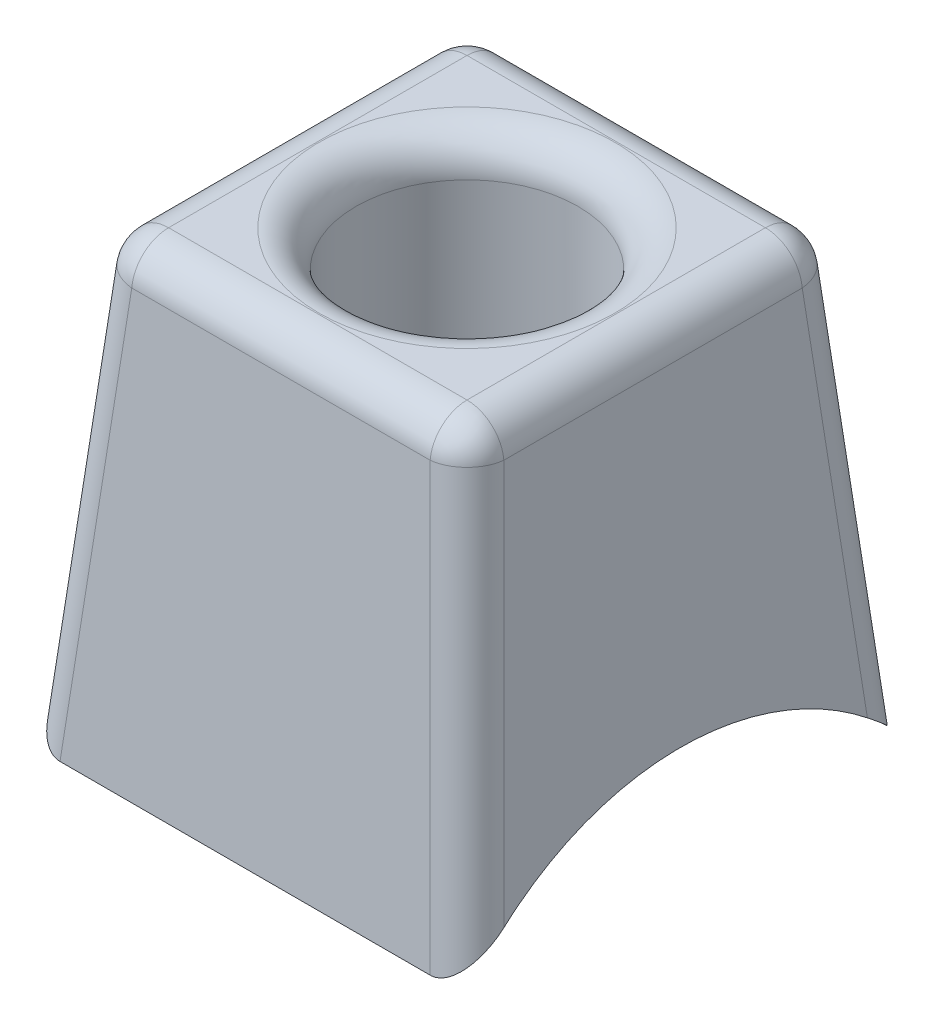
ISO-10303-21;
HEADER;
FILE_DESCRIPTION(('STEP AP214'),'2;1');
FILE_NAME('part.step','',(''),(''),'','','');
FILE_SCHEMA(('AUTOMOTIVE_DESIGN { 1 0 10303 214 1 1 1 1 }'));
ENDSEC;
DATA;
#1=APPLICATION_CONTEXT('core data for automotive mechanical design processes');
#2=APPLICATION_PROTOCOL_DEFINITION('international standard','automotive_design',2000,#1);
#3=PRODUCT_CONTEXT('',#1,'mechanical');
#4=PRODUCT('Part','Part','',(#3));
#5=PRODUCT_RELATED_PRODUCT_CATEGORY('part','',(#4));
#6=PRODUCT_DEFINITION_FORMATION('','',#4);
#7=PRODUCT_DEFINITION_CONTEXT('part definition',#1,'design');
#8=PRODUCT_DEFINITION('design','',#6,#7);
#9=PRODUCT_DEFINITION_SHAPE('','',#8);
#10=(LENGTH_UNIT() NAMED_UNIT(*) SI_UNIT(.MILLI.,.METRE.));
#11=(NAMED_UNIT(*) PLANE_ANGLE_UNIT() SI_UNIT($,.RADIAN.));
#12=(NAMED_UNIT(*) SI_UNIT($,.STERADIAN.) SOLID_ANGLE_UNIT());
#13=UNCERTAINTY_MEASURE_WITH_UNIT(LENGTH_MEASURE(1.E-05),#10,'distance_accuracy_value','');
#14=(GEOMETRIC_REPRESENTATION_CONTEXT(3) GLOBAL_UNCERTAINTY_ASSIGNED_CONTEXT((#13)) GLOBAL_UNIT_ASSIGNED_CONTEXT((#10,
#11,#12)) REPRESENTATION_CONTEXT('',''));
#15=CARTESIAN_POINT('',(0.,0.,0.));
#16=DIRECTION('',(0.,0.,1.));
#17=DIRECTION('',(1.,0.,0.));
#18=AXIS2_PLACEMENT_3D('',#15,#16,#17);
#19=CARTESIAN_POINT('',(0.,0.,0.));
#20=DIRECTION('',(0.996194698091746,0.0871557427476582,0.));
#21=DIRECTION('',(-0.0871557427476582,0.996194698091746,0.));
#22=AXIS2_PLACEMENT_3D('',#19,#20,#21);
#23=PLANE('',#22);
#24=DIRECTION('',(-0.0868265938642476,0.992432509138967,-0.0868265938642476));
#25=VECTOR('',#24,1.);
#26=CARTESIAN_POINT('',(0.00751016977360886,-0.0858416333149665,-0.988684528318136));
#27=LINE('',#26,#25);
#28=CARTESIAN_POINT('',(-0.970000438236766,11.0871557427477,-1.96619513632851));
#29=VERTEX_POINT('',#28);
#30=CARTESIAN_POINT('',(-0.089327435800209,1.02101726326794,-1.08552213389195));
#31=VERTEX_POINT('',#30);
#32=EDGE_CURVE('E140',#29,#31,#27,.F.);
#33=ORIENTED_EDGE('',*,*,#32,.T.);
#34=CARTESIAN_POINT('',(0.462946492454005,-5.29150262212918,-6.));
#35=DIRECTION('',(0.996194698091746,0.0871557427476582,0.));
#36=DIRECTION('',(0.0871557427476582,-0.996194698091746,0.));
#37=AXIS2_PLACEMENT_3D('',#34,#35,#36);
#38=ELLIPSE('',#37,8.03055870034678,8.);
#39=CARTESIAN_POINT('',(-0.0893274358002088,1.02101726326794,-10.914477866108));
#40=VERTEX_POINT('',#39);
#41=EDGE_CURVE('E258',#31,#40,#38,.F.);
#42=ORIENTED_EDGE('',*,*,#41,.T.);
#43=DIRECTION('',(-0.0868265938642476,0.992432509138967,0.0868265938642477));
#44=VECTOR('',#43,1.);
#45=CARTESIAN_POINT('',(-0.0829561190511952,0.948192779589257,-10.9208491828571));
#46=LINE('',#45,#44);
#47=CARTESIAN_POINT('',(-0.970000438236766,11.0871557427477,-10.0338048636715));
#48=VERTEX_POINT('',#47);
#49=EDGE_CURVE('E148',#40,#48,#46,.T.);
#50=ORIENTED_EDGE('',*,*,#49,.T.);
#51=DIRECTION('',(0.,0.,-1.));
#52=VECTOR('',#51,1.);
#53=CARTESIAN_POINT('',(-0.970000438236766,11.0871557427477,-1.04986396231109));
#54=LINE('',#53,#52);
#55=EDGE_CURVE('E138',#48,#29,#54,.F.);
#56=ORIENTED_EDGE('',*,*,#55,.T.);
#57=EDGE_LOOP('',(#33,#42,#50,#56));
#58=FACE_BOUND('',#57,.T.);
#59=ADVANCED_FACE('F34',(#58),#23,.T.);
#60=CARTESIAN_POINT('',(0.,0.,-12.));
#61=DIRECTION('',(0.,0.0871557427476582,-0.996194698091746));
#62=DIRECTION('',(0.,0.996194698091746,0.0871557427476582));
#63=AXIS2_PLACEMENT_3D('',#60,#61,#62);
#64=PLANE('',#63);
#65=DIRECTION('',(-1.,0.,0.));
#66=VECTOR('',#65,1.);
#67=CARTESIAN_POINT('',(0.,0.,-12.));
#68=LINE('',#67,#66);
#69=CARTESIAN_POINT('',(-0.996194698091746,0.,-12.));
#70=VERTEX_POINT('',#69);
#71=CARTESIAN_POINT('',(-11.0038053019083,0.,-12.));
#72=VERTEX_POINT('',#71);
#73=EDGE_CURVE('E118',#70,#72,#68,.T.);
#74=ORIENTED_EDGE('',*,*,#73,.T.);
#75=DIRECTION('',(0.0868265938642476,0.992432509138967,0.0868265938642476));
#76=VECTOR('',#75,1.);
#77=CARTESIAN_POINT('',(-10.9208491828571,0.948192779589257,-11.9170438809488));
#78=LINE('',#77,#76);
#79=CARTESIAN_POINT('',(-10.0338048636715,11.0871557427477,-11.0299995617632));
#80=VERTEX_POINT('',#79);
#81=EDGE_CURVE('E127',#72,#80,#78,.T.);
#82=ORIENTED_EDGE('',*,*,#81,.T.);
#83=DIRECTION('',(-1.,0.,0.));
#84=VECTOR('',#83,1.);
#85=CARTESIAN_POINT('',(-1.04986396231109,11.0871557427477,-11.0299995617632));
#86=LINE('',#85,#84);
#87=CARTESIAN_POINT('',(-1.96619513632851,11.0871557427477,-11.0299995617632));
#88=VERTEX_POINT('',#87);
#89=EDGE_CURVE('E142',#80,#88,#86,.F.);
#90=ORIENTED_EDGE('',*,*,#89,.T.);
#91=DIRECTION('',(-0.0868265938642476,0.992432509138967,0.0868265938642476));
#92=VECTOR('',#91,1.);
#93=CARTESIAN_POINT('',(-0.988684528318137,-0.0858416333149666,-12.0075101697736));
#94=LINE('',#93,#92);
#95=EDGE_CURVE('E130',#88,#70,#94,.F.);
#96=ORIENTED_EDGE('',*,*,#95,.T.);
#97=EDGE_LOOP('',(#74,#82,#90,#96));
#98=FACE_BOUND('',#97,.T.);
#99=ADVANCED_FACE('F126',(#98),#64,.T.);
#100=CARTESIAN_POINT('',(-12.,0.,0.));
#101=DIRECTION('',(-0.996194698091746,0.0871557427476582,0.));
#102=DIRECTION('',(-0.0871557427476582,-0.996194698091746,0.));
#103=AXIS2_PLACEMENT_3D('',#100,#101,#102);
#104=PLANE('',#103);
#105=DIRECTION('',(0.0868265938642476,0.992432509138967,0.0868265938642476));
#106=VECTOR('',#105,1.);
#107=CARTESIAN_POINT('',(-11.9170438809488,0.948192779589257,-10.9208491828571));
#108=LINE('',#107,#106);
#109=CARTESIAN_POINT('',(-11.0299995617632,11.0871557427477,-10.0338048636715));
#110=VERTEX_POINT('',#109);
#111=CARTESIAN_POINT('',(-11.9106725641998,1.02101726326795,-10.914477866108));
#112=VERTEX_POINT('',#111);
#113=EDGE_CURVE('E222',#110,#112,#108,.F.);
#114=ORIENTED_EDGE('',*,*,#113,.T.);
#115=CARTESIAN_POINT('',(-12.462946492454,-5.29150262212918,-6.));
#116=DIRECTION('',(-0.996194698091746,0.0871557427476582,0.));
#117=DIRECTION('',(0.0871557427476582,0.996194698091746,0.));
#118=AXIS2_PLACEMENT_3D('',#115,#116,#117);
#119=ELLIPSE('',#118,8.03055870034678,8.);
#120=CARTESIAN_POINT('',(-11.9106725641998,1.02101726326794,-1.08552213389195));
#121=VERTEX_POINT('',#120);
#122=EDGE_CURVE('E55',#112,#121,#119,.F.);
#123=ORIENTED_EDGE('',*,*,#122,.T.);
#124=DIRECTION('',(0.0868265938642476,0.992432509138967,-0.0868265938642477));
#125=VECTOR('',#124,1.);
#126=CARTESIAN_POINT('',(-12.0075101697736,-0.0858416333149666,-0.988684528318135));
#127=LINE('',#126,#125);
#128=CARTESIAN_POINT('',(-11.0299995617632,11.0871557427477,-1.96619513632851));
#129=VERTEX_POINT('',#128);
#130=EDGE_CURVE('E220',#121,#129,#127,.T.);
#131=ORIENTED_EDGE('',*,*,#130,.T.);
#132=DIRECTION('',(0.,0.,1.));
#133=VECTOR('',#132,1.);
#134=CARTESIAN_POINT('',(-11.0299995617632,11.0871557427477,-10.9501360376889));
#135=LINE('',#134,#133);
#136=EDGE_CURVE('E218',#129,#110,#135,.F.);
#137=ORIENTED_EDGE('',*,*,#136,.T.);
#138=EDGE_LOOP('',(#114,#123,#131,#137));
#139=FACE_BOUND('',#138,.T.);
#140=ADVANCED_FACE('F248',(#139),#104,.T.);
#141=CARTESIAN_POINT('',(0.,0.,0.));
#142=DIRECTION('',(0.,0.0871557427476582,0.996194698091746));
#143=DIRECTION('',(0.,-0.996194698091746,0.0871557427476582));
#144=AXIS2_PLACEMENT_3D('',#141,#142,#143);
#145=PLANE('',#144);
#146=DIRECTION('',(1.,0.,0.));
#147=VECTOR('',#146,1.);
#148=CARTESIAN_POINT('',(0.,0.,0.));
#149=LINE('',#148,#147);
#150=CARTESIAN_POINT('',(-11.0038053019083,0.,0.));
#151=VERTEX_POINT('',#150);
#152=CARTESIAN_POINT('',(-0.996194698091746,0.,0.));
#153=VERTEX_POINT('',#152);
#154=EDGE_CURVE('E131',#151,#153,#149,.T.);
#155=ORIENTED_EDGE('',*,*,#154,.T.);
#156=DIRECTION('',(-0.0868265938642476,0.992432509138967,-0.0868265938642476));
#157=VECTOR('',#156,1.);
#158=CARTESIAN_POINT('',(-0.988684528318136,-0.0858416333149665,0.00751016977360898));
#159=LINE('',#158,#157);
#160=CARTESIAN_POINT('',(-1.96619513632851,11.0871557427477,-0.970000438236766));
#161=VERTEX_POINT('',#160);
#162=EDGE_CURVE('E49',#153,#161,#159,.T.);
#163=ORIENTED_EDGE('',*,*,#162,.T.);
#164=DIRECTION('',(1.,0.,0.));
#165=VECTOR('',#164,1.);
#166=CARTESIAN_POINT('',(-10.9501360376889,11.0871557427477,-0.970000438236765));
#167=LINE('',#166,#165);
#168=CARTESIAN_POINT('',(-10.0338048636715,11.0871557427477,-0.970000438236765));
#169=VERTEX_POINT('',#168);
#170=EDGE_CURVE('E63',#161,#169,#167,.F.);
#171=ORIENTED_EDGE('',*,*,#170,.T.);
#172=DIRECTION('',(0.0868265938642476,0.992432509138967,-0.0868265938642476));
#173=VECTOR('',#172,1.);
#174=CARTESIAN_POINT('',(-10.9208491828571,0.948192779589257,-0.0829561190511938));
#175=LINE('',#174,#173);
#176=EDGE_CURVE('E151',#169,#151,#175,.F.);
#177=ORIENTED_EDGE('',*,*,#176,.T.);
#178=EDGE_LOOP('',(#155,#163,#171,#177));
#179=FACE_BOUND('',#178,.T.);
#180=ADVANCED_FACE('F255',(#179),#145,.T.);
#181=CARTESIAN_POINT('',(0.,12.,0.));
#182=DIRECTION('',(0.,1.,0.));
#183=DIRECTION('',(0.,0.,1.));
#184=AXIS2_PLACEMENT_3D('',#181,#182,#183);
#185=PLANE('',#184);
#186=CARTESIAN_POINT('',(-6.,12.,-6.));
#187=DIRECTION('',(0.,1.,0.));
#188=DIRECTION('',(0.,0.,1.));
#189=AXIS2_PLACEMENT_3D('',#186,#187,#188);
#190=CIRCLE('',#189,4.);
#191=CARTESIAN_POINT('',(-6.,12.,-2.));
#192=VERTEX_POINT('',#191);
#193=EDGE_CURVE('E215',#192,#192,#190,.F.);
#194=ORIENTED_EDGE('',*,*,#193,.T.);
#195=EDGE_LOOP('',(#194));
#196=FACE_BOUND('',#195,.T.);
#197=DIRECTION('',(0.,0.,1.));
#198=VECTOR('',#197,1.);
#199=CARTESIAN_POINT('',(-1.96619513632851,12.,-10.9501360376889));
#200=LINE('',#199,#198);
#201=CARTESIAN_POINT('',(-1.96619513632851,12.,-1.96619513632851));
#202=VERTEX_POINT('',#201);
#203=CARTESIAN_POINT('',(-1.96619513632851,12.,-10.0338048636715));
#204=VERTEX_POINT('',#203);
#205=EDGE_CURVE('E199',#202,#204,#200,.F.);
#206=ORIENTED_EDGE('',*,*,#205,.T.);
#207=DIRECTION('',(1.,0.,0.));
#208=VECTOR('',#207,1.);
#209=CARTESIAN_POINT('',(-10.9501360376889,12.,-10.0338048636715));
#210=LINE('',#209,#208);
#211=CARTESIAN_POINT('',(-10.0338048636715,12.,-10.0338048636715));
#212=VERTEX_POINT('',#211);
#213=EDGE_CURVE('E213',#204,#212,#210,.F.);
#214=ORIENTED_EDGE('',*,*,#213,.T.);
#215=DIRECTION('',(0.,0.,-1.));
#216=VECTOR('',#215,1.);
#217=CARTESIAN_POINT('',(-10.0338048636715,12.,-1.04986396231109));
#218=LINE('',#217,#216);
#219=CARTESIAN_POINT('',(-10.0338048636715,12.,-1.96619513632851));
#220=VERTEX_POINT('',#219);
#221=EDGE_CURVE('E206',#212,#220,#218,.F.);
#222=ORIENTED_EDGE('',*,*,#221,.T.);
#223=DIRECTION('',(-1.,0.,0.));
#224=VECTOR('',#223,1.);
#225=CARTESIAN_POINT('',(-1.04986396231109,12.,-1.96619513632851));
#226=LINE('',#225,#224);
#227=EDGE_CURVE('E203',#220,#202,#226,.F.);
#228=ORIENTED_EDGE('',*,*,#227,.T.);
#229=EDGE_LOOP('',(#206,#214,#222,#228));
#230=FACE_BOUND('',#229,.T.);
#231=ADVANCED_FACE('F234',(#196,#230),#185,.T.);
#232=CARTESIAN_POINT('',(-6.,0.,-6.));
#233=DIRECTION('',(0.,1.,0.));
#234=DIRECTION('',(0.,0.,1.));
#235=AXIS2_PLACEMENT_3D('',#232,#233,#234);
#236=CYLINDRICAL_SURFACE('',#235,3.);
#237=CARTESIAN_POINT('',(-6.,2.12469586496648,-3.));
#238=CARTESIAN_POINT('',(-6.16201496748341,2.12469019002308,-2.99999391788712));
#239=CARTESIAN_POINT('',(-6.32398984512619,2.13006258083395,-3.01316804904636));
#240=CARTESIAN_POINT('',(-6.64305616593522,2.15082056212848,-3.06527624212517));
#241=CARTESIAN_POINT('',(-6.80014775521168,2.16620585271886,-3.10420953254068));
#242=CARTESIAN_POINT('',(-7.10475074318883,2.20500698397974,-3.20620684777703));
#243=CARTESIAN_POINT('',(-7.25228411329191,2.22840356938777,-3.26921305466995));
#244=CARTESIAN_POINT('',(-7.53474379364794,2.28056006187099,-3.41736286514913));
#245=CARTESIAN_POINT('',(-7.66966630056785,2.30932157918124,-3.50251311810007));
#246=CARTESIAN_POINT('',(-7.9297806232427,2.37056887122274,-3.69706677251588));
#247=CARTESIAN_POINT('',(-8.054257059258,2.40316421635299,-3.80739237573364));
#248=CARTESIAN_POINT('',(-8.28344562934377,2.46749239043165,-4.04720832044238));
#249=CARTESIAN_POINT('',(-8.38815354748392,2.49922503416377,-4.1767027394867));
#250=CARTESIAN_POINT('',(-8.578279024591,2.55955485660472,-4.45661068964473));
#251=CARTESIAN_POINT('',(-8.66291894943166,2.58800860234169,-4.60758610492393));
#252=CARTESIAN_POINT('',(-8.80530234504988,2.63725753734701,-4.92288845606952));
#253=CARTESIAN_POINT('',(-8.86305514398396,2.65805538221076,-5.08721073813293));
#254=CARTESIAN_POINT('',(-8.94751579154922,2.68887131993979,-5.41702131664633));
#255=CARTESIAN_POINT('',(-8.97545525488091,2.69931568216631,-5.5821536054368));
#256=CARTESIAN_POINT('',(-9.00344240188998,2.70977766002962,-5.91507127241043));
#257=CARTESIAN_POINT('',(-9.0034991552374,2.70979866616902,-6.08285577012568));
#258=CARTESIAN_POINT('',(-8.97643647706967,2.69968269594855,-6.40748708612894));
#259=CARTESIAN_POINT('',(-8.95066140410244,2.69004821780388,-6.56446435653375));
#260=CARTESIAN_POINT('',(-8.87492816954882,2.66236287651667,-6.87167843596883));
#261=CARTESIAN_POINT('',(-8.82496829547565,2.6443114173846,-7.02191476686076));
#262=CARTESIAN_POINT('',(-8.70165909664858,2.60125276121917,-7.31397803460604));
#263=CARTESIAN_POINT('',(-8.62797998946421,2.57614816726385,-7.45565078457397));
#264=CARTESIAN_POINT('',(-8.4596158061402,2.52152358238491,-7.72497321591576));
#265=CARTESIAN_POINT('',(-8.36492395396097,2.4920021681594,-7.85261835386705));
#266=CARTESIAN_POINT('',(-8.15074542743769,2.42954797095351,-8.09818097359932));
#267=CARTESIAN_POINT('',(-8.0301321687147,2.39651665301953,-8.2150922905172));
#268=CARTESIAN_POINT('',(-7.77081401334133,2.33214659091423,-8.4274079113966));
#269=CARTESIAN_POINT('',(-7.63210458676857,2.30080827333008,-8.52280681389449));
#270=CARTESIAN_POINT('',(-7.33656106512264,2.24275144738231,-8.69131223613208));
#271=CARTESIAN_POINT('',(-7.17939301282854,2.21615091901318,-8.76387695690677));
#272=CARTESIAN_POINT('',(-6.85380754987223,2.17194614859392,-8.88112928869847));
#273=CARTESIAN_POINT('',(-6.68539645687429,2.15433690150234,-8.92583241207699));
#274=CARTESIAN_POINT('',(-6.35204807532451,2.13128932278623,-8.98380383422378));
#275=CARTESIAN_POINT('',(-6.18743178891606,2.12523308282418,-8.99867042318745));
#276=CARTESIAN_POINT('',(-5.85798128652817,2.12422816824854,-9.00115771271731));
#277=CARTESIAN_POINT('',(-5.69314713529811,2.12927671791844,-8.9887852218731));
#278=CARTESIAN_POINT('',(-5.37614015542173,2.14928501049611,-8.93859467040516));
#279=CARTESIAN_POINT('',(-5.2237377284699,2.163762902208,-8.90201236668503));
#280=CARTESIAN_POINT('',(-4.92730411056039,2.20042711878984,-8.8059954928122));
#281=CARTESIAN_POINT('',(-4.78327464166394,2.22261502287203,-8.74655624069231));
#282=CARTESIAN_POINT('',(-4.50167112384737,2.27322224019473,-8.60400584550571));
#283=CARTESIAN_POINT('',(-4.36454141572526,2.30184395571274,-8.52009090354097));
#284=CARTESIAN_POINT('',(-4.10574203654798,2.36175366375602,-8.33182635724954));
#285=CARTESIAN_POINT('',(-3.98407805075075,2.39304262975219,-8.22746927392868));
#286=CARTESIAN_POINT('',(-3.75166325360979,2.45715830893468,-7.99345468180189));
#287=CARTESIAN_POINT('',(-3.64209318246249,2.48995676501142,-7.86261268298213));
#288=CARTESIAN_POINT('',(-3.44632326482113,2.55149487713681,-7.5835949435063));
#289=CARTESIAN_POINT('',(-3.36012349410833,2.58023452002409,-7.43541914664534));
#290=CARTESIAN_POINT('',(-3.21410788760078,2.63039709196187,-7.12603265893695));
#291=CARTESIAN_POINT('',(-3.1542017524148,2.65184500463102,-6.96486886612925));
#292=CARTESIAN_POINT('',(-3.06268717230016,2.68508611212224,-6.63376377504651));
#293=CARTESIAN_POINT('',(-3.0310654291552,2.69688384385907,-6.46382664144718));
#294=CARTESIAN_POINT('',(-2.99845119449035,2.70906552421229,-6.13067117054763));
#295=CARTESIAN_POINT('',(-2.99578103388202,2.7100745969461,-5.96763846387831));
#296=CARTESIAN_POINT('',(-3.01683031889079,2.70219517405529,-5.64354642717515));
#297=CARTESIAN_POINT('',(-3.04054658177171,2.69330787213344,-5.48248686150948));
#298=CARTESIAN_POINT('',(-3.11251770298724,2.66691916994623,-5.17090350324575));
#299=CARTESIAN_POINT('',(-3.16015981175672,2.64963320543112,-5.02021853786233));
#300=CARTESIAN_POINT('',(-3.27802002676873,2.60825305029066,-4.72896905398722));
#301=CARTESIAN_POINT('',(-3.3482424066095,2.58415757098427,-4.58840645744891));
#302=CARTESIAN_POINT('',(-3.51262788700963,2.53030974387212,-4.31491964601118));
#303=CARTESIAN_POINT('',(-3.60767328102833,2.50036218004669,-4.18256490230631));
#304=CARTESIAN_POINT('',(-3.81761566037518,2.43848753176841,-3.93516530495326));
#305=CARTESIAN_POINT('',(-3.93251973161564,2.40655974335399,-3.82012665748815));
#306=CARTESIAN_POINT('',(-4.18612826329024,2.34225997265156,-3.60437571527614));
#307=CARTESIAN_POINT('',(-4.32576880430908,2.30995348484344,-3.50474000367968));
#308=CARTESIAN_POINT('',(-4.62083173914619,2.25046387795416,-3.33030580886295));
#309=CARTESIAN_POINT('',(-4.77625576810524,2.22328129053468,-3.25550990243616));
#310=CARTESIAN_POINT('',(-5.10591136195261,2.17654277489488,-3.13068226051553));
#311=CARTESIAN_POINT('',(-5.28066873303041,2.15737344353085,-3.08187994201234));
#312=CARTESIAN_POINT('',(-5.63697054390473,2.13145726475419,-3.01655286555562));
#313=CARTESIAN_POINT('',(-5.81851042539443,2.12470222205237,-3.00000681319816));
#314=CARTESIAN_POINT('',(-6.,2.12469586496648,-3.));
#315=B_SPLINE_CURVE_WITH_KNOTS('',3,(#237,#238,#239,#240,#241,#242,#243,#244,#245,#246,#247,
#248,#249,#250,#251,#252,#253,#254,#255,#256,#257,#258,#259,#260,#261,#262,#263,#264,#265,#266,
#267,#268,#269,#270,#271,#272,#273,#274,#275,#276,#277,#278,#279,#280,#281,#282,#283,#284,#285,
#286,#287,#288,#289,#290,#291,#292,#293,#294,#295,#296,#297,#298,#299,#300,#301,#302,#303,#304,
#305,#306,#307,#308,#309,#310,#311,#312,#313,#314),.UNSPECIFIED.,.T.,.F.,(4,2,2,2,2,2,2,2,2,2,2,
2,2,2,2,2,2,2,2,2,2,2,2,2,2,2,2,2,2,2,2,2,2,2,2,2,2,2,4),(0.,0.485369082889299,
0.970723629307669,1.45491971362402,1.93926135947583,2.44549304813251,2.95183257656962,
3.47540144283838,3.99878852773656,4.49960036990354,5.0002493082071,5.47612945617384,
5.95204330537667,6.43488262432332,6.91787787268947,7.42913350142745,7.94051735665665,
8.46325184520833,8.98569503290589,9.47931315500611,9.97280790797409,10.4428769187604,
10.9130422687869,11.4008312203128,11.8887989695235,12.4077003400689,12.9266033932,
13.4437101779998,13.9605737113989,14.4473144111951,14.933996406586,15.4088054802742,
15.883704470453,16.3785664737361,16.8736054180957,17.394771991038,17.9159926110813,
18.4600635776149,19.0037752466575),.UNSPECIFIED.);
#316=CARTESIAN_POINT('',(-6.,2.12469586496648,-3.));
#317=VERTEX_POINT('',#316);
#318=EDGE_CURVE('E156',#317,#317,#315,.T.);
#319=ORIENTED_EDGE('',*,*,#318,.T.);
#320=EDGE_LOOP('',(#319));
#321=FACE_BOUND('',#320,.T.);
#322=CARTESIAN_POINT('',(-6.,11.,-6.));
#323=DIRECTION('',(0.,1.,0.));
#324=DIRECTION('',(0.,0.,1.));
#325=AXIS2_PLACEMENT_3D('',#322,#323,#324);
#326=CIRCLE('',#325,3.);
#327=CARTESIAN_POINT('',(-6.,11.,-3.));
#328=VERTEX_POINT('',#327);
#329=EDGE_CURVE('E204',#328,#328,#326,.T.);
#330=ORIENTED_EDGE('',*,*,#329,.T.);
#331=EDGE_LOOP('',(#330));
#332=FACE_BOUND('',#331,.T.);
#333=ADVANCED_FACE('F281',(#321,#332),#236,.F.);
#334=CARTESIAN_POINT('',(-6.,11.,-6.));
#335=DIRECTION('',(0.,1.,0.));
#336=DIRECTION('',(0.,0.,1.));
#337=AXIS2_PLACEMENT_3D('',#334,#335,#336);
#338=TOROIDAL_SURFACE('',#337,4.,1.);
#339=ORIENTED_EDGE('',*,*,#193,.F.);
#340=EDGE_LOOP('',(#339));
#341=FACE_BOUND('',#340,.T.);
#342=ORIENTED_EDGE('',*,*,#329,.F.);
#343=EDGE_LOOP('',(#342));
#344=FACE_BOUND('',#343,.T.);
#345=ADVANCED_FACE('F308',(#341,#344),#338,.T.);
#346=CARTESIAN_POINT('',(-0.988684528318137,-0.172997376062625,-0.988684528318136));
#347=DIRECTION('',(0.0868265938642476,-0.992432509138967,0.0868265938642476));
#348=DIRECTION('',(0.996194698091746,0.0871557427476582,0.));
#349=AXIS2_PLACEMENT_3D('',#346,#347,#348);
#350=CYLINDRICAL_SURFACE('',#349,1.);
#351=CARTESIAN_POINT('',(-0.0893274358002089,1.02101726326794,-1.08552213389195));
#352=CARTESIAN_POINT('',(-0.0864802691590515,0.988358660826262,-1.04356496545311));
#353=CARTESIAN_POINT('',(-0.085854307697167,0.955206992791338,-1.00185316042709));
#354=CARTESIAN_POINT('',(-0.0889542951664815,0.888146856477284,-0.919178655128379));
#355=CARTESIAN_POINT('',(-0.0926819225815846,0.854238101255791,-0.878216249965302));
#356=CARTESIAN_POINT('',(-0.104451085384399,0.785624616026482,-0.79698355427547));
#357=CARTESIAN_POINT('',(-0.112529481566568,0.750915546683311,-0.756722257638035));
#358=CARTESIAN_POINT('',(-0.13301581716057,0.68128248412379,-0.677536393155109));
#359=CARTESIAN_POINT('',(-0.145422582631742,0.646358551703099,-0.638611466000458));
#360=CARTESIAN_POINT('',(-0.182937461644087,0.556782463002433,-0.540685921999204));
#361=CARTESIAN_POINT('',(-0.211257882483084,0.502182462806563,-0.482828915025444));
#362=CARTESIAN_POINT('',(-0.279491707122573,0.395042229008469,-0.372471857234542));
#363=CARTESIAN_POINT('',(-0.319366229343257,0.342495747178483,-0.319954624978422));
#364=CARTESIAN_POINT('',(-0.394667788628566,0.261404906526773,-0.240910060758098));
#365=CARTESIAN_POINT('',(-0.426029158618676,0.231326116240939,-0.212088886997159));
#366=CARTESIAN_POINT('',(-0.494371993769108,0.174283629081507,-0.158193117499424));
#367=CARTESIAN_POINT('',(-0.531347017107826,0.147316423220021,-0.133114291899239));
#368=CARTESIAN_POINT('',(-0.602010996876168,0.103947170000354,-0.0932425168363261));
#369=CARTESIAN_POINT('',(-0.634488550789717,0.0865432201687576,-0.0774115224705048));
#370=CARTESIAN_POINT('',(-0.702748306394719,0.0557578300232598,-0.0496021264575842));
#371=CARTESIAN_POINT('',(-0.73851969429142,0.0423638002095046,-0.0376116586733319));
#372=CARTESIAN_POINT('',(-0.810541784183711,0.0213525001650161,-0.0188829713833914));
#373=CARTESIAN_POINT('',(-0.846626990582784,0.0134300091761293,-0.0118665318840646));
#374=CARTESIAN_POINT('',(-0.901925842581769,0.00541283917755829,-0.00477703202495523));
#375=CARTESIAN_POINT('',(-0.920665013714204,0.00338459419353672,-0.00298620463070972));
#376=CARTESIAN_POINT('',(-0.958331148876722,0.000675322981194877,-0.000595526651510438));
#377=CARTESIAN_POINT('',(-0.97725825272643,-4.61065077445699E-06,3.35805097577983E-06));
#378=CARTESIAN_POINT('',(-0.996194698091745,0.,0.));
#379=B_SPLINE_CURVE_WITH_KNOTS('',3,(#351,#352,#353,#354,#355,#356,#357,#358,#359,#360,#361,
#362,#363,#364,#365,#366,#367,#368,#369,#370,#371,#372,#373,#374,#375,#376,#377,#378),
.UNSPECIFIED.,.F.,.F.,(4,2,2,2,2,2,2,2,2,2,2,2,2,4),(0.,0.159673048007097,0.319407676734022,
0.480517409512632,0.641583480023601,0.89405820521636,1.14569298452713,1.30172766414576,
1.45758462444678,1.57746733811225,1.69696962412369,1.80910486881028,1.86582777719267,
1.92259663190482),.UNSPECIFIED.);
#380=EDGE_CURVE('E257',#31,#153,#379,.T.);
#381=ORIENTED_EDGE('',*,*,#380,.F.);
#382=ORIENTED_EDGE('',*,*,#32,.F.);
#383=CARTESIAN_POINT('',(-1.96619513632851,11.,-1.96619513632851));
#384=DIRECTION('',(-0.0868265938642481,0.992432509138967,-0.0868265938642482));
#385=DIRECTION('',(0.,0.0871557427476587,0.996194698091746));
#386=AXIS2_PLACEMENT_3D('',#383,#384,#385);
#387=CIRCLE('',#386,1.);
#388=EDGE_CURVE('E132',#161,#29,#387,.T.);
#389=ORIENTED_EDGE('',*,*,#388,.F.);
#390=ORIENTED_EDGE('',*,*,#162,.F.);
#391=EDGE_LOOP('',(#381,#382,#389,#390));
#392=FACE_BOUND('',#391,.T.);
#393=ADVANCED_FACE('F36',(#392),#350,.T.);
#394=CARTESIAN_POINT('',(-1.96619513632851,11.,-1.96619513632851));
#395=DIRECTION('',(0.,0.,1.));
#396=DIRECTION('',(1.,0.,0.));
#397=AXIS2_PLACEMENT_3D('',#394,#395,#396);
#398=SPHERICAL_SURFACE('',#397,1.);
#399=CARTESIAN_POINT('',(-1.96619513632851,11.,-1.96619513632851));
#400=DIRECTION('',(1.,0.,0.));
#401=DIRECTION('',(0.,0.,-1.));
#402=AXIS2_PLACEMENT_3D('',#399,#400,#401);
#403=CIRCLE('',#402,1.);
#404=EDGE_CURVE('E179',#161,#202,#403,.F.);
#405=ORIENTED_EDGE('',*,*,#404,.F.);
#406=ORIENTED_EDGE('',*,*,#388,.T.);
#407=CARTESIAN_POINT('',(-1.96619513632851,11.,-1.96619513632851));
#408=DIRECTION('',(0.,0.,1.));
#409=DIRECTION('',(1.,0.,0.));
#410=AXIS2_PLACEMENT_3D('',#407,#408,#409);
#411=CIRCLE('',#410,1.);
#412=EDGE_CURVE('E182',#202,#29,#411,.F.);
#413=ORIENTED_EDGE('',*,*,#412,.F.);
#414=EDGE_LOOP('',(#405,#406,#413));
#415=FACE_BOUND('',#414,.T.);
#416=ADVANCED_FACE('F189',(#415),#398,.T.);
#417=CARTESIAN_POINT('',(-0.988684528318136,-0.172997376062625,-11.0113154716819));
#418=DIRECTION('',(0.0868265938642476,-0.992432509138967,-0.0868265938642477));
#419=DIRECTION('',(0.,0.0871557427476582,-0.996194698091746));
#420=AXIS2_PLACEMENT_3D('',#417,#418,#419);
#421=CYLINDRICAL_SURFACE('',#420,1.);
#422=CARTESIAN_POINT('',(-0.996194698091745,0.,-12.));
#423=CARTESIAN_POINT('',(-0.976400994379547,-5.46622164645765E-06,-12.0000039690945));
#424=CARTESIAN_POINT('',(-0.956618223348272,0.00073793827660177,-11.9993492581133));
#425=CARTESIAN_POINT('',(-0.917268270057748,0.00369763389542423,-11.9967374776987));
#426=CARTESIAN_POINT('',(-0.897700904257272,0.0059125533202568,-11.9947816211465));
#427=CARTESIAN_POINT('',(-0.840053028875574,0.014654187289572,-11.9870495434262));
#428=CARTESIAN_POINT('',(-0.802511305574251,0.0232793479600808,-11.9794077576196));
#429=CARTESIAN_POINT('',(-0.730292259693812,0.045304333983236,-11.9597569279225));
#430=CARTESIAN_POINT('',(-0.695606028141266,0.0586885575674225,-11.9477621519413));
#431=CARTESIAN_POINT('',(-0.629374639876735,0.0892008190760337,-11.9201736689238));
#432=CARTESIAN_POINT('',(-0.597839609764515,0.106340395199536,-11.9045688617444));
#433=CARTESIAN_POINT('',(-0.52316963980712,0.152610787031417,-11.8619994053362));
#434=CARTESIAN_POINT('',(-0.482119471339114,0.183452078304863,-11.833256243176));
#435=CARTESIAN_POINT('',(-0.407010611995406,0.248813328390449,-11.7712175744642));
#436=CARTESIAN_POINT('',(-0.372968946818256,0.283341943124541,-11.737911301888));
#437=CARTESIAN_POINT('',(-0.295153510268417,0.372956044417712,-11.6497445300197));
#438=CARTESIAN_POINT('',(-0.255486187685949,0.429417096288882,-11.5926626569758));
#439=CARTESIAN_POINT('',(-0.18888718623619,0.543992952709441,-11.4730169783719));
#440=CARTESIAN_POINT('',(-0.161981024505921,0.602110826421736,-11.4104424832467));
#441=CARTESIAN_POINT('',(-0.118895840917554,0.721729379060305,-11.2772633822798));
#442=CARTESIAN_POINT('',(-0.103472714365984,0.78321977566233,-11.2064017398377));
#443=CARTESIAN_POINT('',(-0.0905107566298982,0.873870181614182,-11.0980773888082));
#444=CARTESIAN_POINT('',(-0.0878785261510272,0.903737386052226,-11.0617402700297));
#445=CARTESIAN_POINT('',(-0.0860266167012916,0.962866007409314,-10.988495785275));
#446=CARTESIAN_POINT('',(-0.0868067094906228,0.992127464713384,-10.9515884576029));
#447=CARTESIAN_POINT('',(-0.0893274358002088,1.02101726326794,-10.914477866108));
#448=B_SPLINE_CURVE_WITH_KNOTS('',3,(#422,#423,#424,#425,#426,#427,#428,#429,#430,#431,#432,
#433,#434,#435,#436,#437,#438,#439,#440,#441,#442,#443,#444,#445,#446,#447),.UNSPECIFIED.,.F.,
.F.,(4,2,2,2,2,2,2,2,2,2,2,2,4),(0.,0.0593344138919887,0.118613595737771,0.235653364651651,
0.352312923793545,0.469336071475969,0.644876479117015,0.820838420686315,1.08804150105739,
1.35577664961413,1.63987081134504,1.78109095632391,1.92230165566623),.UNSPECIFIED.);
#449=EDGE_CURVE('E228',#70,#40,#448,.T.);
#450=ORIENTED_EDGE('',*,*,#449,.F.);
#451=ORIENTED_EDGE('',*,*,#95,.F.);
#452=CARTESIAN_POINT('',(-1.96619513632851,11.,-10.0338048636715));
#453=DIRECTION('',(-0.0868265938642481,0.992432509138967,0.0868265938642481));
#454=DIRECTION('',(-0.996194698091746,-0.0871557427476587,0.));
#455=AXIS2_PLACEMENT_3D('',#452,#453,#454);
#456=CIRCLE('',#455,1.);
#457=EDGE_CURVE('E176',#48,#88,#456,.T.);
#458=ORIENTED_EDGE('',*,*,#457,.F.);
#459=ORIENTED_EDGE('',*,*,#49,.F.);
#460=EDGE_LOOP('',(#450,#451,#458,#459));
#461=FACE_BOUND('',#460,.T.);
#462=ADVANCED_FACE('F226',(#461),#421,.T.);
#463=CARTESIAN_POINT('',(-1.96619513632851,11.,0.));
#464=DIRECTION('',(0.,0.,-1.));
#465=DIRECTION('',(-1.,0.,0.));
#466=AXIS2_PLACEMENT_3D('',#463,#464,#465);
#467=CYLINDRICAL_SURFACE('',#466,1.);
#468=ORIENTED_EDGE('',*,*,#412,.T.);
#469=ORIENTED_EDGE('',*,*,#55,.F.);
#470=CARTESIAN_POINT('',(-1.96619513632851,11.,-10.0338048636715));
#471=DIRECTION('',(0.,0.,-1.));
#472=DIRECTION('',(-1.,0.,0.));
#473=AXIS2_PLACEMENT_3D('',#470,#471,#472);
#474=CIRCLE('',#473,1.);
#475=EDGE_CURVE('E173',#204,#48,#474,.T.);
#476=ORIENTED_EDGE('',*,*,#475,.F.);
#477=ORIENTED_EDGE('',*,*,#205,.F.);
#478=EDGE_LOOP('',(#468,#469,#476,#477));
#479=FACE_BOUND('',#478,.T.);
#480=ADVANCED_FACE('F196',(#479),#467,.T.);
#481=CARTESIAN_POINT('',(0.,11.,-1.96619513632851));
#482=DIRECTION('',(1.,0.,0.));
#483=DIRECTION('',(0.,0.,-1.));
#484=AXIS2_PLACEMENT_3D('',#481,#482,#483);
#485=CYLINDRICAL_SURFACE('',#484,1.);
#486=ORIENTED_EDGE('',*,*,#404,.T.);
#487=ORIENTED_EDGE('',*,*,#227,.F.);
#488=CARTESIAN_POINT('',(-10.0338048636715,11.,-1.96619513632851));
#489=DIRECTION('',(-1.,0.,0.));
#490=DIRECTION('',(0.,-1.,0.));
#491=AXIS2_PLACEMENT_3D('',#488,#489,#490);
#492=CIRCLE('',#491,1.);
#493=EDGE_CURVE('E170',#169,#220,#492,.T.);
#494=ORIENTED_EDGE('',*,*,#493,.F.);
#495=ORIENTED_EDGE('',*,*,#170,.F.);
#496=EDGE_LOOP('',(#486,#487,#494,#495));
#497=FACE_BOUND('',#496,.T.);
#498=ADVANCED_FACE('F240',(#497),#485,.T.);
#499=CARTESIAN_POINT('',(-10.9208491828571,0.861037036841599,-1.07915081714294));
#500=DIRECTION('',(-0.0868265938642476,-0.992432509138967,0.0868265938642477));
#501=DIRECTION('',(0.,-0.0871557427476582,-0.996194698091746));
#502=AXIS2_PLACEMENT_3D('',#499,#500,#501);
#503=CYLINDRICAL_SURFACE('',#502,1.);
#504=CARTESIAN_POINT('',(-11.0038053019083,0.,0.));
#505=CARTESIAN_POINT('',(-11.0235990056204,-5.46622164492724E-06,3.96909453791808E-06));
#506=CARTESIAN_POINT('',(-11.0433817766517,0.000737938276603209,-0.000650741886730232));
#507=CARTESIAN_POINT('',(-11.0827317299422,0.0036976338954252,-0.00326252230126946));
#508=CARTESIAN_POINT('',(-11.1022990957427,0.00591255332025735,-0.00521837885354381));
#509=CARTESIAN_POINT('',(-11.1599469711244,0.0146541872895727,-0.0129504565737979));
#510=CARTESIAN_POINT('',(-11.1974886944257,0.0232793479600836,-0.0205922423803802));
#511=CARTESIAN_POINT('',(-11.2697077403062,0.0453043339832383,-0.0402430720775023));
#512=CARTESIAN_POINT('',(-11.3043939718587,0.0586885575674222,-0.0522378480587331));
#513=CARTESIAN_POINT('',(-11.3706253601233,0.0892008190760317,-0.079826331076197));
#514=CARTESIAN_POINT('',(-11.4021603902355,0.106340395199535,-0.0954311382556445));
#515=CARTESIAN_POINT('',(-11.4768303601929,0.152610787031418,-0.138000594663821));
#516=CARTESIAN_POINT('',(-11.5178805286609,0.183452078304866,-0.166743756823985));
#517=CARTESIAN_POINT('',(-11.5929893880046,0.248813328390453,-0.228782425535822));
#518=CARTESIAN_POINT('',(-11.6270310531817,0.283341943124543,-0.262088698112033));
#519=CARTESIAN_POINT('',(-11.7048464897316,0.372956044417713,-0.350255469980249));
#520=CARTESIAN_POINT('',(-11.744513812314,0.429417096288883,-0.407337343024188));
#521=CARTESIAN_POINT('',(-11.8111128137638,0.543992952709441,-0.526983021628122));
#522=CARTESIAN_POINT('',(-11.8380189754941,0.602110826421734,-0.589557516753263));
#523=CARTESIAN_POINT('',(-11.8811041590824,0.721729379060302,-0.722736617720147));
#524=CARTESIAN_POINT('',(-11.896527285634,0.783219775662328,-0.793598260162251));
#525=CARTESIAN_POINT('',(-11.9094892433701,0.87387018161418,-0.901922611191798));
#526=CARTESIAN_POINT('',(-11.912121473849,0.903737386052224,-0.938259729970279));
#527=CARTESIAN_POINT('',(-11.9139733832987,0.962866007409313,-1.01150421472495));
#528=CARTESIAN_POINT('',(-11.9131932905094,0.992127464713383,-1.04841154239709));
#529=CARTESIAN_POINT('',(-11.9106725641998,1.02101726326794,-1.08552213389195));
#530=B_SPLINE_CURVE_WITH_KNOTS('',3,(#504,#505,#506,#507,#508,#509,#510,#511,#512,#513,#514,
#515,#516,#517,#518,#519,#520,#521,#522,#523,#524,#525,#526,#527,#528,#529),.UNSPECIFIED.,.F.,
.F.,(4,2,2,2,2,2,2,2,2,2,2,2,4),(0.,0.0593344138919897,0.118613595737772,0.235653364651651,
0.352312923793542,0.46933607147597,0.644876479117019,0.820838420686316,1.08804150105739,
1.35577664961413,1.63987081134504,1.7810909563239,1.92230165566623),.UNSPECIFIED.);
#531=EDGE_CURVE('E253',#151,#121,#530,.T.);
#532=ORIENTED_EDGE('',*,*,#531,.F.);
#533=ORIENTED_EDGE('',*,*,#176,.F.);
#534=CARTESIAN_POINT('',(-10.0338048636715,11.,-1.96619513632851));
#535=DIRECTION('',(0.0868265938642482,0.992432509138967,-0.0868265938642484));
#536=DIRECTION('',(0.,0.087155742747659,0.996194698091745));
#537=AXIS2_PLACEMENT_3D('',#534,#535,#536);
#538=CIRCLE('',#537,1.);
#539=EDGE_CURVE('E167',#129,#169,#538,.T.);
#540=ORIENTED_EDGE('',*,*,#539,.F.);
#541=ORIENTED_EDGE('',*,*,#130,.F.);
#542=EDGE_LOOP('',(#532,#533,#540,#541));
#543=FACE_BOUND('',#542,.T.);
#544=ADVANCED_FACE('F252',(#543),#503,.T.);
#545=CARTESIAN_POINT('',(-1.96619513632851,11.,-10.0338048636715));
#546=DIRECTION('',(0.,0.,1.));
#547=DIRECTION('',(1.,0.,0.));
#548=AXIS2_PLACEMENT_3D('',#545,#546,#547);
#549=SPHERICAL_SURFACE('',#548,1.);
#550=ORIENTED_EDGE('',*,*,#475,.T.);
#551=ORIENTED_EDGE('',*,*,#457,.T.);
#552=CARTESIAN_POINT('',(-1.96619513632851,11.,-10.0338048636715));
#553=DIRECTION('',(1.,0.,0.));
#554=DIRECTION('',(0.,1.,0.));
#555=AXIS2_PLACEMENT_3D('',#552,#553,#554);
#556=CIRCLE('',#555,1.);
#557=EDGE_CURVE('E164',#204,#88,#556,.F.);
#558=ORIENTED_EDGE('',*,*,#557,.F.);
#559=EDGE_LOOP('',(#550,#551,#558));
#560=FACE_BOUND('',#559,.T.);
#561=ADVANCED_FACE('F230',(#560),#549,.T.);
#562=CARTESIAN_POINT('',(-10.0338048636715,11.,-1.96619513632851));
#563=DIRECTION('',(0.,0.,1.));
#564=DIRECTION('',(1.,0.,0.));
#565=AXIS2_PLACEMENT_3D('',#562,#563,#564);
#566=SPHERICAL_SURFACE('',#565,1.);
#567=ORIENTED_EDGE('',*,*,#539,.T.);
#568=ORIENTED_EDGE('',*,*,#493,.T.);
#569=CARTESIAN_POINT('',(-10.0338048636715,11.,-1.96619513632851));
#570=DIRECTION('',(0.,0.,1.));
#571=DIRECTION('',(1.,0.,0.));
#572=AXIS2_PLACEMENT_3D('',#569,#570,#571);
#573=CIRCLE('',#572,1.);
#574=EDGE_CURVE('E161',#129,#220,#573,.F.);
#575=ORIENTED_EDGE('',*,*,#574,.F.);
#576=EDGE_LOOP('',(#567,#568,#575));
#577=FACE_BOUND('',#576,.T.);
#578=ADVANCED_FACE('F243',(#577),#566,.T.);
#579=CARTESIAN_POINT('',(0.,11.,-10.0338048636715));
#580=DIRECTION('',(-1.,0.,0.));
#581=DIRECTION('',(0.,0.,1.));
#582=AXIS2_PLACEMENT_3D('',#579,#580,#581);
#583=CYLINDRICAL_SURFACE('',#582,1.);
#584=ORIENTED_EDGE('',*,*,#557,.T.);
#585=ORIENTED_EDGE('',*,*,#89,.F.);
#586=CARTESIAN_POINT('',(-10.0338048636715,11.,-10.0338048636715));
#587=DIRECTION('',(-1.,0.,0.));
#588=DIRECTION('',(0.,0.,1.));
#589=AXIS2_PLACEMENT_3D('',#586,#587,#588);
#590=CIRCLE('',#589,1.);
#591=EDGE_CURVE('E158',#212,#80,#590,.T.);
#592=ORIENTED_EDGE('',*,*,#591,.F.);
#593=ORIENTED_EDGE('',*,*,#213,.F.);
#594=EDGE_LOOP('',(#584,#585,#592,#593));
#595=FACE_BOUND('',#594,.T.);
#596=ADVANCED_FACE('F232',(#595),#583,.T.);
#597=CARTESIAN_POINT('',(-10.0338048636715,11.,0.));
#598=DIRECTION('',(0.,0.,1.));
#599=DIRECTION('',(1.,0.,0.));
#600=AXIS2_PLACEMENT_3D('',#597,#598,#599);
#601=CYLINDRICAL_SURFACE('',#600,1.);
#602=ORIENTED_EDGE('',*,*,#574,.T.);
#603=ORIENTED_EDGE('',*,*,#221,.F.);
#604=CARTESIAN_POINT('',(-10.0338048636715,11.,-10.0338048636715));
#605=DIRECTION('',(0.,0.,-1.));
#606=DIRECTION('',(0.,1.,0.));
#607=AXIS2_PLACEMENT_3D('',#604,#605,#606);
#608=CIRCLE('',#607,1.);
#609=EDGE_CURVE('E155',#110,#212,#608,.T.);
#610=ORIENTED_EDGE('',*,*,#609,.F.);
#611=ORIENTED_EDGE('',*,*,#136,.F.);
#612=EDGE_LOOP('',(#602,#603,#610,#611));
#613=FACE_BOUND('',#612,.T.);
#614=ADVANCED_FACE('F246',(#613),#601,.T.);
#615=CARTESIAN_POINT('',(-10.0338048636715,11.,-10.0338048636715));
#616=DIRECTION('',(0.,0.,1.));
#617=DIRECTION('',(1.,0.,0.));
#618=AXIS2_PLACEMENT_3D('',#615,#616,#617);
#619=SPHERICAL_SURFACE('',#618,1.);
#620=ORIENTED_EDGE('',*,*,#609,.T.);
#621=ORIENTED_EDGE('',*,*,#591,.T.);
#622=CARTESIAN_POINT('',(-10.0338048636715,11.,-10.0338048636715));
#623=DIRECTION('',(0.0868265938642482,0.992432509138967,0.0868265938642481));
#624=DIRECTION('',(-0.996194698091746,0.0871557427476588,0.));
#625=AXIS2_PLACEMENT_3D('',#622,#623,#624);
#626=CIRCLE('',#625,1.);
#627=EDGE_CURVE('E137',#110,#80,#626,.F.);
#628=ORIENTED_EDGE('',*,*,#627,.F.);
#629=EDGE_LOOP('',(#620,#621,#628));
#630=FACE_BOUND('',#629,.T.);
#631=ADVANCED_FACE('F325',(#630),#619,.T.);
#632=CARTESIAN_POINT('',(-10.9208491828571,0.861037036841599,-10.9208491828571));
#633=DIRECTION('',(-0.0868265938642476,-0.992432509138967,-0.0868265938642476));
#634=DIRECTION('',(0.996194698091746,-0.0871557427476582,0.));
#635=AXIS2_PLACEMENT_3D('',#632,#633,#634);
#636=CYLINDRICAL_SURFACE('',#635,1.);
#637=CARTESIAN_POINT('',(-11.9106725641998,1.02101726326795,-10.914477866108));
#638=CARTESIAN_POINT('',(-11.9135197308409,0.988358660826264,-10.9564350345469));
#639=CARTESIAN_POINT('',(-11.9141456923028,0.95520699279134,-10.9981468395729));
#640=CARTESIAN_POINT('',(-11.9110457048335,0.888146856477288,-11.0808213448716));
#641=CARTESIAN_POINT('',(-11.9073180774184,0.854238101255795,-11.1217837500347));
#642=CARTESIAN_POINT('',(-11.8955489146156,0.785624616026486,-11.2030164457245));
#643=CARTESIAN_POINT('',(-11.8874705184334,0.750915546683315,-11.243277742362));
#644=CARTESIAN_POINT('',(-11.8669841828394,0.681282484123794,-11.3224636068449));
#645=CARTESIAN_POINT('',(-11.8545774173683,0.646358551703103,-11.3613885339995));
#646=CARTESIAN_POINT('',(-11.8170625383559,0.556782463002437,-11.4593140780008));
#647=CARTESIAN_POINT('',(-11.7887421175169,0.502182462806566,-11.5171710849745));
#648=CARTESIAN_POINT('',(-11.7205082928774,0.395042229008472,-11.6275281427655));
#649=CARTESIAN_POINT('',(-11.6806337706567,0.342495747178485,-11.6800453750216));
#650=CARTESIAN_POINT('',(-11.6053322113714,0.261404906526775,-11.7590899392419));
#651=CARTESIAN_POINT('',(-11.5739708413813,0.231326116240941,-11.7879111130028));
#652=CARTESIAN_POINT('',(-11.5056280062309,0.17428362908151,-11.8418068825006));
#653=CARTESIAN_POINT('',(-11.4686529828922,0.147316423220024,-11.8668857081008));
#654=CARTESIAN_POINT('',(-11.3979890031238,0.103947170000356,-11.9067574831637));
#655=CARTESIAN_POINT('',(-11.3655114492103,0.0865432201687588,-11.9225884775295));
#656=CARTESIAN_POINT('',(-11.2972516936053,0.0557578300232609,-11.9503978735424));
#657=CARTESIAN_POINT('',(-11.2614803057086,0.0423638002095068,-11.9623883413267));
#658=CARTESIAN_POINT('',(-11.1894582158163,0.0213525001650176,-11.9811170286166));
#659=CARTESIAN_POINT('',(-11.1533730094172,0.0134300091761294,-11.9881334681159));
#660=CARTESIAN_POINT('',(-11.0980741574182,0.00541283917755825,-11.995222967975));
#661=CARTESIAN_POINT('',(-11.0793349862858,0.00338459419353698,-11.9970137953693));
#662=CARTESIAN_POINT('',(-11.0416688511233,0.000675322981195365,-11.9994044733485));
#663=CARTESIAN_POINT('',(-11.0227417472736,-4.61065077398938E-06,-12.000003358051));
#664=CARTESIAN_POINT('',(-11.0038053019083,0.,-12.));
#665=B_SPLINE_CURVE_WITH_KNOTS('',3,(#637,#638,#639,#640,#641,#642,#643,#644,#645,#646,#647,
#648,#649,#650,#651,#652,#653,#654,#655,#656,#657,#658,#659,#660,#661,#662,#663,#664),
.UNSPECIFIED.,.F.,.F.,(4,2,2,2,2,2,2,2,2,2,2,2,2,4),(0.,0.159673048007095,0.319407676734019,
0.480517409512628,0.641583480023598,0.894058205216359,1.14569298452713,1.30172766414576,
1.45758462444678,1.57746733811225,1.69696962412369,1.80910486881029,1.86582777719268,
1.92259663190483),.UNSPECIFIED.);
#666=EDGE_CURVE('E11',#112,#72,#665,.T.);
#667=ORIENTED_EDGE('',*,*,#666,.F.);
#668=ORIENTED_EDGE('',*,*,#113,.F.);
#669=ORIENTED_EDGE('',*,*,#627,.T.);
#670=ORIENTED_EDGE('',*,*,#81,.F.);
#671=EDGE_LOOP('',(#667,#668,#669,#670));
#672=FACE_BOUND('',#671,.T.);
#673=ADVANCED_FACE('F135',(#672),#636,.T.);
#674=CARTESIAN_POINT('',(-12.,-5.29150262212918,-6.));
#675=DIRECTION('',(1.,0.,0.));
#676=DIRECTION('',(0.,0.,-1.));
#677=AXIS2_PLACEMENT_3D('',#674,#675,#676);
#678=CYLINDRICAL_SURFACE('',#677,8.);
#679=ORIENTED_EDGE('',*,*,#380,.T.);
#680=ORIENTED_EDGE('',*,*,#154,.F.);
#681=ORIENTED_EDGE('',*,*,#531,.T.);
#682=ORIENTED_EDGE('',*,*,#122,.F.);
#683=ORIENTED_EDGE('',*,*,#666,.T.);
#684=ORIENTED_EDGE('',*,*,#73,.F.);
#685=ORIENTED_EDGE('',*,*,#449,.T.);
#686=ORIENTED_EDGE('',*,*,#41,.F.);
#687=EDGE_LOOP('',(#679,#680,#681,#682,#683,#684,#685,#686));
#688=FACE_BOUND('',#687,.T.);
#689=ORIENTED_EDGE('',*,*,#318,.F.);
#690=EDGE_LOOP('',(#689));
#691=FACE_BOUND('',#690,.T.);
#692=ADVANCED_FACE('F116',(#688,#691),#678,.F.);
#693=CLOSED_SHELL('',(#59,#99,#140,#180,#231,#333,#345,#393,#416,#462,#480,#498,#544,#561,#578,
#596,#614,#631,#673,#692));
#694=MANIFOLD_SOLID_BREP('B2',#693);
#695=ADVANCED_BREP_SHAPE_REPRESENTATION('',(#18,#694),#14);
#696=SHAPE_DEFINITION_REPRESENTATION(#9,#695);
ENDSEC;
END-ISO-10303-21;
